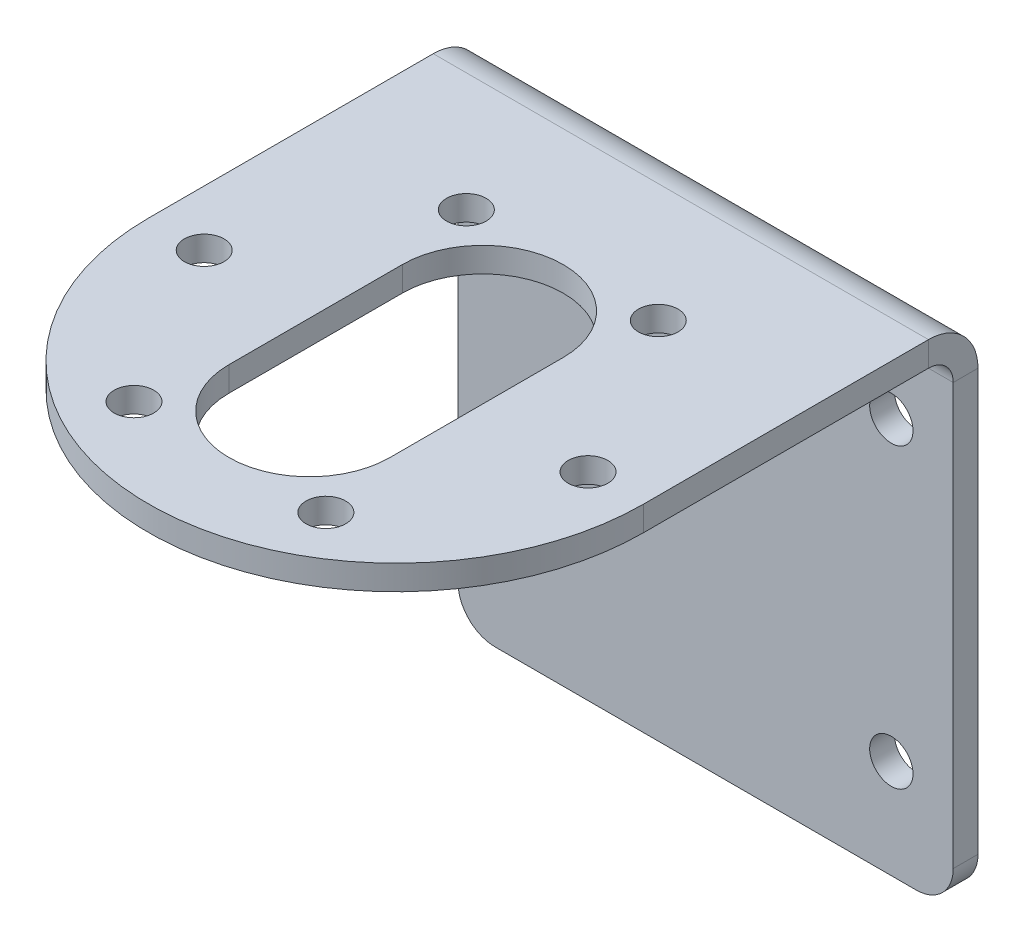
ISO-10303-21;
HEADER;
FILE_DESCRIPTION(('STEP AP214'),'2;1');
FILE_NAME('part.step','',(''),(''),'','','');
FILE_SCHEMA(('AUTOMOTIVE_DESIGN { 1 0 10303 214 1 1 1 1 }'));
ENDSEC;
DATA;
#1=APPLICATION_CONTEXT('core data for automotive mechanical design processes');
#2=APPLICATION_PROTOCOL_DEFINITION('international standard','automotive_design',2000,#1);
#3=PRODUCT_CONTEXT('',#1,'mechanical');
#4=PRODUCT('Part','Part','',(#3));
#5=PRODUCT_RELATED_PRODUCT_CATEGORY('part','',(#4));
#6=PRODUCT_DEFINITION_FORMATION('','',#4);
#7=PRODUCT_DEFINITION_CONTEXT('part definition',#1,'design');
#8=PRODUCT_DEFINITION('design','',#6,#7);
#9=PRODUCT_DEFINITION_SHAPE('','',#8);
#10=(LENGTH_UNIT() NAMED_UNIT(*) SI_UNIT(.MILLI.,.METRE.));
#11=(NAMED_UNIT(*) PLANE_ANGLE_UNIT() SI_UNIT($,.RADIAN.));
#12=(NAMED_UNIT(*) SI_UNIT($,.STERADIAN.) SOLID_ANGLE_UNIT());
#13=UNCERTAINTY_MEASURE_WITH_UNIT(LENGTH_MEASURE(1.E-05),#10,'distance_accuracy_value','');
#14=(GEOMETRIC_REPRESENTATION_CONTEXT(3) GLOBAL_UNCERTAINTY_ASSIGNED_CONTEXT((#13)) GLOBAL_UNIT_ASSIGNED_CONTEXT((#10,
#11,#12)) REPRESENTATION_CONTEXT('',''));
#15=CARTESIAN_POINT('',(0.,0.,0.));
#16=DIRECTION('',(0.,0.,1.));
#17=DIRECTION('',(1.,0.,0.));
#18=AXIS2_PLACEMENT_3D('',#15,#16,#17);
#19=CARTESIAN_POINT('',(7.75,21.5,13.576606241341));
#20=DIRECTION('',(0.,-1.,0.));
#21=DIRECTION('',(-1.,0.,0.));
#22=AXIS2_PLACEMENT_3D('',#19,#20,#21);
#23=CYLINDRICAL_SURFACE('',#22,1.6);
#24=CARTESIAN_POINT('',(7.75,21.5,13.576606241341));
#25=DIRECTION('',(0.,1.,0.));
#26=DIRECTION('',(-1.,0.,0.));
#27=AXIS2_PLACEMENT_3D('',#24,#25,#26);
#28=CIRCLE('',#27,1.6);
#29=CARTESIAN_POINT('',(6.15,21.5,13.576606241341));
#30=VERTEX_POINT('',#29);
#31=EDGE_CURVE('E240',#30,#30,#28,.T.);
#32=ORIENTED_EDGE('',*,*,#31,.T.);
#33=DIRECTION('',(0.,-1.,0.));
#34=VECTOR('',#33,1.);
#35=CARTESIAN_POINT('',(6.15,21.5,13.576606241341));
#36=LINE('',#35,#34);
#37=CARTESIAN_POINT('',(6.15,19.5,13.576606241341));
#38=VERTEX_POINT('',#37);
#39=EDGE_CURVE('E11',#30,#38,#36,.T.);
#40=ORIENTED_EDGE('',*,*,#39,.T.);
#41=CARTESIAN_POINT('',(7.75,19.5,13.576606241341));
#42=DIRECTION('',(0.,-1.,0.));
#43=DIRECTION('',(-1.,0.,0.));
#44=AXIS2_PLACEMENT_3D('',#41,#42,#43);
#45=CIRCLE('',#44,1.6);
#46=EDGE_CURVE('E235',#38,#38,#45,.T.);
#47=ORIENTED_EDGE('',*,*,#46,.T.);
#48=ORIENTED_EDGE('',*,*,#39,.F.);
#49=EDGE_LOOP('',(#32,#40,#47,#48));
#50=FACE_BOUND('',#49,.T.);
#51=ADVANCED_FACE('F16',(#50),#23,.F.);
#52=CARTESIAN_POINT('',(15.5,21.5,27.));
#53=DIRECTION('',(0.,-1.,0.));
#54=DIRECTION('',(-1.,0.,0.));
#55=AXIS2_PLACEMENT_3D('',#52,#53,#54);
#56=CYLINDRICAL_SURFACE('',#55,1.6);
#57=CARTESIAN_POINT('',(15.5,21.5,27.));
#58=DIRECTION('',(0.,1.,0.));
#59=DIRECTION('',(-1.,0.,0.));
#60=AXIS2_PLACEMENT_3D('',#57,#58,#59);
#61=CIRCLE('',#60,1.6);
#62=CARTESIAN_POINT('',(13.9,21.5,27.));
#63=VERTEX_POINT('',#62);
#64=EDGE_CURVE('E236',#63,#63,#61,.T.);
#65=ORIENTED_EDGE('',*,*,#64,.T.);
#66=DIRECTION('',(0.,-1.,0.));
#67=VECTOR('',#66,1.);
#68=CARTESIAN_POINT('',(13.9,21.5,27.));
#69=LINE('',#68,#67);
#70=CARTESIAN_POINT('',(13.9,19.5,27.));
#71=VERTEX_POINT('',#70);
#72=EDGE_CURVE('E27',#63,#71,#69,.T.);
#73=ORIENTED_EDGE('',*,*,#72,.T.);
#74=CARTESIAN_POINT('',(15.5,19.5,27.));
#75=DIRECTION('',(0.,-1.,0.));
#76=DIRECTION('',(-1.,0.,0.));
#77=AXIS2_PLACEMENT_3D('',#74,#75,#76);
#78=CIRCLE('',#77,1.6);
#79=EDGE_CURVE('E321',#71,#71,#78,.T.);
#80=ORIENTED_EDGE('',*,*,#79,.T.);
#81=ORIENTED_EDGE('',*,*,#72,.F.);
#82=EDGE_LOOP('',(#65,#73,#80,#81));
#83=FACE_BOUND('',#82,.T.);
#84=ADVANCED_FACE('F588',(#83),#56,.F.);
#85=CARTESIAN_POINT('',(7.75,21.5,40.423393758659));
#86=DIRECTION('',(0.,-1.,0.));
#87=DIRECTION('',(-1.,0.,0.));
#88=AXIS2_PLACEMENT_3D('',#85,#86,#87);
#89=CYLINDRICAL_SURFACE('',#88,1.6);
#90=CARTESIAN_POINT('',(7.75,21.5,40.423393758659));
#91=DIRECTION('',(0.,1.,0.));
#92=DIRECTION('',(-1.,0.,0.));
#93=AXIS2_PLACEMENT_3D('',#90,#91,#92);
#94=CIRCLE('',#93,1.6);
#95=CARTESIAN_POINT('',(6.15,21.5,40.423393758659));
#96=VERTEX_POINT('',#95);
#97=EDGE_CURVE('E241',#96,#96,#94,.T.);
#98=ORIENTED_EDGE('',*,*,#97,.T.);
#99=DIRECTION('',(0.,-1.,0.));
#100=VECTOR('',#99,1.);
#101=CARTESIAN_POINT('',(6.15,21.5,40.423393758659));
#102=LINE('',#101,#100);
#103=CARTESIAN_POINT('',(6.15,19.5,40.423393758659));
#104=VERTEX_POINT('',#103);
#105=EDGE_CURVE('E250',#96,#104,#102,.T.);
#106=ORIENTED_EDGE('',*,*,#105,.T.);
#107=CARTESIAN_POINT('',(7.75,19.5,40.423393758659));
#108=DIRECTION('',(0.,-1.,0.));
#109=DIRECTION('',(-1.,0.,0.));
#110=AXIS2_PLACEMENT_3D('',#107,#108,#109);
#111=CIRCLE('',#110,1.6);
#112=EDGE_CURVE('E317',#104,#104,#111,.T.);
#113=ORIENTED_EDGE('',*,*,#112,.T.);
#114=ORIENTED_EDGE('',*,*,#105,.F.);
#115=EDGE_LOOP('',(#98,#106,#113,#114));
#116=FACE_BOUND('',#115,.T.);
#117=ADVANCED_FACE('F594',(#116),#89,.F.);
#118=CARTESIAN_POINT('',(-7.75,21.5,40.423393758659));
#119=DIRECTION('',(0.,-1.,0.));
#120=DIRECTION('',(-1.,0.,0.));
#121=AXIS2_PLACEMENT_3D('',#118,#119,#120);
#122=CYLINDRICAL_SURFACE('',#121,1.6);
#123=CARTESIAN_POINT('',(-7.75,21.5,40.423393758659));
#124=DIRECTION('',(0.,1.,0.));
#125=DIRECTION('',(-1.,0.,0.));
#126=AXIS2_PLACEMENT_3D('',#123,#124,#125);
#127=CIRCLE('',#126,1.6);
#128=CARTESIAN_POINT('',(-9.35,21.5,40.423393758659));
#129=VERTEX_POINT('',#128);
#130=EDGE_CURVE('E299',#129,#129,#127,.T.);
#131=ORIENTED_EDGE('',*,*,#130,.T.);
#132=DIRECTION('',(0.,-1.,0.));
#133=VECTOR('',#132,1.);
#134=CARTESIAN_POINT('',(-9.35,21.5,40.423393758659));
#135=LINE('',#134,#133);
#136=CARTESIAN_POINT('',(-9.35,19.5,40.423393758659));
#137=VERTEX_POINT('',#136);
#138=EDGE_CURVE('E41',#129,#137,#135,.T.);
#139=ORIENTED_EDGE('',*,*,#138,.T.);
#140=CARTESIAN_POINT('',(-7.75,19.5,40.423393758659));
#141=DIRECTION('',(0.,-1.,0.));
#142=DIRECTION('',(-1.,0.,0.));
#143=AXIS2_PLACEMENT_3D('',#140,#141,#142);
#144=CIRCLE('',#143,1.6);
#145=EDGE_CURVE('E231',#137,#137,#144,.T.);
#146=ORIENTED_EDGE('',*,*,#145,.T.);
#147=ORIENTED_EDGE('',*,*,#138,.F.);
#148=EDGE_LOOP('',(#131,#139,#146,#147));
#149=FACE_BOUND('',#148,.T.);
#150=ADVANCED_FACE('F620',(#149),#122,.F.);
#151=CARTESIAN_POINT('',(-7.75,21.5,13.576606241341));
#152=DIRECTION('',(0.,-1.,0.));
#153=DIRECTION('',(-1.,0.,0.));
#154=AXIS2_PLACEMENT_3D('',#151,#152,#153);
#155=CYLINDRICAL_SURFACE('',#154,1.6);
#156=CARTESIAN_POINT('',(-7.75,21.5,13.576606241341));
#157=DIRECTION('',(0.,1.,0.));
#158=DIRECTION('',(-1.,0.,0.));
#159=AXIS2_PLACEMENT_3D('',#156,#157,#158);
#160=CIRCLE('',#159,1.6);
#161=CARTESIAN_POINT('',(-9.35,21.5,13.576606241341));
#162=VERTEX_POINT('',#161);
#163=EDGE_CURVE('E295',#162,#162,#160,.T.);
#164=ORIENTED_EDGE('',*,*,#163,.T.);
#165=DIRECTION('',(0.,-1.,0.));
#166=VECTOR('',#165,1.);
#167=CARTESIAN_POINT('',(-9.35,21.5,13.576606241341));
#168=LINE('',#167,#166);
#169=CARTESIAN_POINT('',(-9.35,19.5,13.576606241341));
#170=VERTEX_POINT('',#169);
#171=EDGE_CURVE('E220',#162,#170,#168,.T.);
#172=ORIENTED_EDGE('',*,*,#171,.T.);
#173=CARTESIAN_POINT('',(-7.75,19.5,13.576606241341));
#174=DIRECTION('',(0.,-1.,0.));
#175=DIRECTION('',(-1.,0.,0.));
#176=AXIS2_PLACEMENT_3D('',#173,#174,#175);
#177=CIRCLE('',#176,1.6);
#178=EDGE_CURVE('E322',#170,#170,#177,.T.);
#179=ORIENTED_EDGE('',*,*,#178,.T.);
#180=ORIENTED_EDGE('',*,*,#171,.F.);
#181=EDGE_LOOP('',(#164,#172,#179,#180));
#182=FACE_BOUND('',#181,.T.);
#183=ADVANCED_FACE('F616',(#182),#155,.F.);
#184=CARTESIAN_POINT('',(-15.5,21.5,27.));
#185=DIRECTION('',(0.,-1.,0.));
#186=DIRECTION('',(-1.,0.,0.));
#187=AXIS2_PLACEMENT_3D('',#184,#185,#186);
#188=CYLINDRICAL_SURFACE('',#187,1.6);
#189=CARTESIAN_POINT('',(-15.5,21.5,27.));
#190=DIRECTION('',(0.,1.,0.));
#191=DIRECTION('',(-1.,0.,0.));
#192=AXIS2_PLACEMENT_3D('',#189,#190,#191);
#193=CIRCLE('',#192,1.6);
#194=CARTESIAN_POINT('',(-17.1,21.5,27.));
#195=VERTEX_POINT('',#194);
#196=EDGE_CURVE('E300',#195,#195,#193,.T.);
#197=ORIENTED_EDGE('',*,*,#196,.T.);
#198=DIRECTION('',(0.,-1.,0.));
#199=VECTOR('',#198,1.);
#200=CARTESIAN_POINT('',(-17.1,21.5,27.));
#201=LINE('',#200,#199);
#202=CARTESIAN_POINT('',(-17.1,19.5,27.));
#203=VERTEX_POINT('',#202);
#204=EDGE_CURVE('E224',#195,#203,#201,.T.);
#205=ORIENTED_EDGE('',*,*,#204,.T.);
#206=CARTESIAN_POINT('',(-15.5,19.5,27.));
#207=DIRECTION('',(0.,-1.,0.));
#208=DIRECTION('',(-1.,0.,0.));
#209=AXIS2_PLACEMENT_3D('',#206,#207,#208);
#210=CIRCLE('',#209,1.6);
#211=EDGE_CURVE('E380',#203,#203,#210,.T.);
#212=ORIENTED_EDGE('',*,*,#211,.T.);
#213=ORIENTED_EDGE('',*,*,#204,.F.);
#214=EDGE_LOOP('',(#197,#205,#212,#213));
#215=FACE_BOUND('',#214,.T.);
#216=ADVANCED_FACE('F619',(#215),#188,.F.);
#217=CARTESIAN_POINT('',(0.,21.5,34.));
#218=DIRECTION('',(0.,-1.,0.));
#219=DIRECTION('',(-1.,0.,0.));
#220=AXIS2_PLACEMENT_3D('',#217,#218,#219);
#221=CYLINDRICAL_SURFACE('',#220,6.5);
#222=CARTESIAN_POINT('',(0.,21.5,34.));
#223=DIRECTION('',(0.,1.,0.));
#224=DIRECTION('',(-1.,0.,0.));
#225=AXIS2_PLACEMENT_3D('',#222,#223,#224);
#226=CIRCLE('',#225,6.5);
#227=CARTESIAN_POINT('',(-6.5,21.5,34.));
#228=VERTEX_POINT('',#227);
#229=CARTESIAN_POINT('',(6.5,21.5,34.));
#230=VERTEX_POINT('',#229);
#231=EDGE_CURVE('E283',#228,#230,#226,.T.);
#232=ORIENTED_EDGE('',*,*,#231,.T.);
#233=DIRECTION('',(0.,-1.,0.));
#234=VECTOR('',#233,1.);
#235=CARTESIAN_POINT('',(6.5,21.5,34.));
#236=LINE('',#235,#234);
#237=CARTESIAN_POINT('',(6.5,19.5,34.));
#238=VERTEX_POINT('',#237);
#239=EDGE_CURVE('E284',#230,#238,#236,.T.);
#240=ORIENTED_EDGE('',*,*,#239,.T.);
#241=CARTESIAN_POINT('',(0.,19.5,34.));
#242=DIRECTION('',(0.,-1.,0.));
#243=DIRECTION('',(1.,0.,0.));
#244=AXIS2_PLACEMENT_3D('',#241,#242,#243);
#245=CIRCLE('',#244,6.5);
#246=CARTESIAN_POINT('',(-6.5,19.5,34.));
#247=VERTEX_POINT('',#246);
#248=EDGE_CURVE('E255',#238,#247,#245,.T.);
#249=ORIENTED_EDGE('',*,*,#248,.T.);
#250=DIRECTION('',(0.,-1.,0.));
#251=VECTOR('',#250,1.);
#252=CARTESIAN_POINT('',(-6.5,21.5,34.));
#253=LINE('',#252,#251);
#254=EDGE_CURVE('E288',#228,#247,#253,.T.);
#255=ORIENTED_EDGE('',*,*,#254,.F.);
#256=EDGE_LOOP('',(#232,#240,#249,#255));
#257=FACE_BOUND('',#256,.T.);
#258=ADVANCED_FACE('F628',(#257),#221,.F.);
#259=CARTESIAN_POINT('',(-6.5,20.,27.));
#260=DIRECTION('',(1.,0.,0.));
#261=DIRECTION('',(0.,1.,0.));
#262=AXIS2_PLACEMENT_3D('',#259,#260,#261);
#263=PLANE('',#262);
#264=DIRECTION('',(0.,0.,1.));
#265=VECTOR('',#264,1.);
#266=CARTESIAN_POINT('',(-6.5,21.5,20.));
#267=LINE('',#266,#265);
#268=CARTESIAN_POINT('',(-6.5,21.5,20.));
#269=VERTEX_POINT('',#268);
#270=EDGE_CURVE('E278',#269,#228,#267,.T.);
#271=ORIENTED_EDGE('',*,*,#270,.T.);
#272=ORIENTED_EDGE('',*,*,#254,.T.);
#273=DIRECTION('',(0.,0.,-1.));
#274=VECTOR('',#273,1.);
#275=CARTESIAN_POINT('',(-6.5,19.5,34.));
#276=LINE('',#275,#274);
#277=CARTESIAN_POINT('',(-6.5,19.5,20.));
#278=VERTEX_POINT('',#277);
#279=EDGE_CURVE('E251',#247,#278,#276,.T.);
#280=ORIENTED_EDGE('',*,*,#279,.T.);
#281=DIRECTION('',(0.,-1.,0.));
#282=VECTOR('',#281,1.);
#283=CARTESIAN_POINT('',(-6.5,21.5,20.));
#284=LINE('',#283,#282);
#285=EDGE_CURVE('E287',#269,#278,#284,.T.);
#286=ORIENTED_EDGE('',*,*,#285,.F.);
#287=EDGE_LOOP('',(#271,#272,#280,#286));
#288=FACE_BOUND('',#287,.T.);
#289=ADVANCED_FACE('F610',(#288),#263,.T.);
#290=CARTESIAN_POINT('',(0.,21.5,20.));
#291=DIRECTION('',(0.,-1.,0.));
#292=DIRECTION('',(1.,0.,0.));
#293=AXIS2_PLACEMENT_3D('',#290,#291,#292);
#294=CYLINDRICAL_SURFACE('',#293,6.5);
#295=CARTESIAN_POINT('',(0.,21.5,20.));
#296=DIRECTION('',(0.,1.,0.));
#297=DIRECTION('',(1.,0.,0.));
#298=AXIS2_PLACEMENT_3D('',#295,#296,#297);
#299=CIRCLE('',#298,6.5);
#300=CARTESIAN_POINT('',(6.5,21.5,20.));
#301=VERTEX_POINT('',#300);
#302=EDGE_CURVE('E282',#301,#269,#299,.T.);
#303=ORIENTED_EDGE('',*,*,#302,.T.);
#304=ORIENTED_EDGE('',*,*,#285,.T.);
#305=CARTESIAN_POINT('',(0.,19.5,20.));
#306=DIRECTION('',(0.,-1.,0.));
#307=DIRECTION('',(-1.,0.,0.));
#308=AXIS2_PLACEMENT_3D('',#305,#306,#307);
#309=CIRCLE('',#308,6.5);
#310=CARTESIAN_POINT('',(6.5,19.5,20.));
#311=VERTEX_POINT('',#310);
#312=EDGE_CURVE('E256',#278,#311,#309,.T.);
#313=ORIENTED_EDGE('',*,*,#312,.T.);
#314=DIRECTION('',(0.,-1.,0.));
#315=VECTOR('',#314,1.);
#316=CARTESIAN_POINT('',(6.5,21.5,20.));
#317=LINE('',#316,#315);
#318=EDGE_CURVE('E234',#301,#311,#317,.T.);
#319=ORIENTED_EDGE('',*,*,#318,.F.);
#320=EDGE_LOOP('',(#303,#304,#313,#319));
#321=FACE_BOUND('',#320,.T.);
#322=ADVANCED_FACE('F604',(#321),#294,.F.);
#323=CARTESIAN_POINT('',(6.5,20.,27.));
#324=DIRECTION('',(-1.,0.,0.));
#325=DIRECTION('',(0.,1.,0.));
#326=AXIS2_PLACEMENT_3D('',#323,#324,#325);
#327=PLANE('',#326);
#328=DIRECTION('',(0.,0.,-1.));
#329=VECTOR('',#328,1.);
#330=CARTESIAN_POINT('',(6.5,21.5,34.));
#331=LINE('',#330,#329);
#332=EDGE_CURVE('E345',#230,#301,#331,.T.);
#333=ORIENTED_EDGE('',*,*,#332,.T.);
#334=ORIENTED_EDGE('',*,*,#318,.T.);
#335=DIRECTION('',(0.,0.,1.));
#336=VECTOR('',#335,1.);
#337=CARTESIAN_POINT('',(6.5,19.5,20.));
#338=LINE('',#337,#336);
#339=EDGE_CURVE('E349',#311,#238,#338,.T.);
#340=ORIENTED_EDGE('',*,*,#339,.T.);
#341=ORIENTED_EDGE('',*,*,#239,.F.);
#342=EDGE_LOOP('',(#333,#334,#340,#341));
#343=FACE_BOUND('',#342,.T.);
#344=ADVANCED_FACE('F600',(#343),#327,.T.);
#345=CARTESIAN_POINT('',(0.,21.5,27.));
#346=DIRECTION('',(0.,-1.,0.));
#347=DIRECTION('',(1.,0.,0.));
#348=AXIS2_PLACEMENT_3D('',#345,#346,#347);
#349=CYLINDRICAL_SURFACE('',#348,20.);
#350=DIRECTION('',(0.,-1.,0.));
#351=VECTOR('',#350,1.);
#352=CARTESIAN_POINT('',(-20.,21.5,27.));
#353=LINE('',#352,#351);
#354=CARTESIAN_POINT('',(-20.,21.5,27.));
#355=VERTEX_POINT('',#354);
#356=CARTESIAN_POINT('',(-20.,19.5,27.));
#357=VERTEX_POINT('',#356);
#358=EDGE_CURVE('E395',#355,#357,#353,.T.);
#359=ORIENTED_EDGE('',*,*,#358,.T.);
#360=CARTESIAN_POINT('',(0.,19.5,27.));
#361=DIRECTION('',(0.,1.,0.));
#362=DIRECTION('',(-1.,0.,0.));
#363=AXIS2_PLACEMENT_3D('',#360,#361,#362);
#364=CIRCLE('',#363,20.);
#365=CARTESIAN_POINT('',(20.,19.5,27.));
#366=VERTEX_POINT('',#365);
#367=EDGE_CURVE('E393',#357,#366,#364,.T.);
#368=ORIENTED_EDGE('',*,*,#367,.T.);
#369=DIRECTION('',(0.,-1.,0.));
#370=VECTOR('',#369,1.);
#371=CARTESIAN_POINT('',(20.,21.5,27.));
#372=LINE('',#371,#370);
#373=CARTESIAN_POINT('',(20.,21.5,27.));
#374=VERTEX_POINT('',#373);
#375=EDGE_CURVE('E225',#374,#366,#372,.T.);
#376=ORIENTED_EDGE('',*,*,#375,.F.);
#377=CARTESIAN_POINT('',(0.,21.5,27.));
#378=DIRECTION('',(0.,-1.,0.));
#379=DIRECTION('',(1.,0.,0.));
#380=AXIS2_PLACEMENT_3D('',#377,#378,#379);
#381=CIRCLE('',#380,20.);
#382=EDGE_CURVE('E311',#374,#355,#381,.T.);
#383=ORIENTED_EDGE('',*,*,#382,.T.);
#384=EDGE_LOOP('',(#359,#368,#376,#383));
#385=FACE_BOUND('',#384,.T.);
#386=ADVANCED_FACE('F603',(#385),#349,.T.);
#387=CARTESIAN_POINT('',(0.,19.5,25.5));
#388=DIRECTION('',(0.,1.,0.));
#389=DIRECTION('',(0.,0.,-1.));
#390=AXIS2_PLACEMENT_3D('',#387,#388,#389);
#391=PLANE('',#390);
#392=ORIENTED_EDGE('',*,*,#145,.F.);
#393=EDGE_LOOP('',(#392));
#394=FACE_BOUND('',#393,.T.);
#395=ORIENTED_EDGE('',*,*,#46,.F.);
#396=EDGE_LOOP('',(#395));
#397=FACE_BOUND('',#396,.T.);
#398=ORIENTED_EDGE('',*,*,#79,.F.);
#399=EDGE_LOOP('',(#398));
#400=FACE_BOUND('',#399,.T.);
#401=ORIENTED_EDGE('',*,*,#112,.F.);
#402=EDGE_LOOP('',(#401));
#403=FACE_BOUND('',#402,.T.);
#404=ORIENTED_EDGE('',*,*,#178,.F.);
#405=EDGE_LOOP('',(#404));
#406=FACE_BOUND('',#405,.T.);
#407=ORIENTED_EDGE('',*,*,#211,.F.);
#408=EDGE_LOOP('',(#407));
#409=FACE_BOUND('',#408,.T.);
#410=ORIENTED_EDGE('',*,*,#312,.F.);
#411=ORIENTED_EDGE('',*,*,#279,.F.);
#412=ORIENTED_EDGE('',*,*,#248,.F.);
#413=ORIENTED_EDGE('',*,*,#339,.F.);
#414=EDGE_LOOP('',(#410,#411,#412,#413));
#415=FACE_BOUND('',#414,.T.);
#416=DIRECTION('',(-1.,0.,0.));
#417=VECTOR('',#416,1.);
#418=CARTESIAN_POINT('',(20.,19.5,4.));
#419=LINE('',#418,#417);
#420=CARTESIAN_POINT('',(20.,19.5,4.));
#421=VERTEX_POINT('',#420);
#422=CARTESIAN_POINT('',(-20.,19.5,4.));
#423=VERTEX_POINT('',#422);
#424=EDGE_CURVE('E246',#421,#423,#419,.T.);
#425=ORIENTED_EDGE('',*,*,#424,.F.);
#426=DIRECTION('',(0.,0.,-1.));
#427=VECTOR('',#426,1.);
#428=CARTESIAN_POINT('',(20.,19.5,27.));
#429=LINE('',#428,#427);
#430=EDGE_CURVE('E229',#366,#421,#429,.T.);
#431=ORIENTED_EDGE('',*,*,#430,.F.);
#432=ORIENTED_EDGE('',*,*,#367,.F.);
#433=DIRECTION('',(0.,0.,-1.));
#434=VECTOR('',#433,1.);
#435=CARTESIAN_POINT('',(-20.,19.5,27.));
#436=LINE('',#435,#434);
#437=EDGE_CURVE('E272',#357,#423,#436,.T.);
#438=ORIENTED_EDGE('',*,*,#437,.T.);
#439=EDGE_LOOP('',(#425,#431,#432,#438));
#440=FACE_BOUND('',#439,.T.);
#441=ADVANCED_FACE('F446',(#394,#397,#400,#403,#406,#409,#415,#440),#391,.F.);
#442=CARTESIAN_POINT('',(0.,21.5,25.5));
#443=DIRECTION('',(0.,-1.,0.));
#444=DIRECTION('',(-1.,0.,0.));
#445=AXIS2_PLACEMENT_3D('',#442,#443,#444);
#446=PLANE('',#445);
#447=ORIENTED_EDGE('',*,*,#31,.F.);
#448=EDGE_LOOP('',(#447));
#449=FACE_BOUND('',#448,.T.);
#450=ORIENTED_EDGE('',*,*,#64,.F.);
#451=EDGE_LOOP('',(#450));
#452=FACE_BOUND('',#451,.T.);
#453=ORIENTED_EDGE('',*,*,#97,.F.);
#454=EDGE_LOOP('',(#453));
#455=FACE_BOUND('',#454,.T.);
#456=ORIENTED_EDGE('',*,*,#130,.F.);
#457=EDGE_LOOP('',(#456));
#458=FACE_BOUND('',#457,.T.);
#459=ORIENTED_EDGE('',*,*,#163,.F.);
#460=EDGE_LOOP('',(#459));
#461=FACE_BOUND('',#460,.T.);
#462=ORIENTED_EDGE('',*,*,#196,.F.);
#463=EDGE_LOOP('',(#462));
#464=FACE_BOUND('',#463,.T.);
#465=ORIENTED_EDGE('',*,*,#231,.F.);
#466=ORIENTED_EDGE('',*,*,#270,.F.);
#467=ORIENTED_EDGE('',*,*,#302,.F.);
#468=ORIENTED_EDGE('',*,*,#332,.F.);
#469=EDGE_LOOP('',(#465,#466,#467,#468));
#470=FACE_BOUND('',#469,.T.);
#471=DIRECTION('',(-1.,0.,0.));
#472=VECTOR('',#471,1.);
#473=CARTESIAN_POINT('',(20.,21.5,4.));
#474=LINE('',#473,#472);
#475=CARTESIAN_POINT('',(20.,21.5,4.));
#476=VERTEX_POINT('',#475);
#477=CARTESIAN_POINT('',(-20.,21.5,4.));
#478=VERTEX_POINT('',#477);
#479=EDGE_CURVE('E242',#476,#478,#474,.T.);
#480=ORIENTED_EDGE('',*,*,#479,.T.);
#481=DIRECTION('',(0.,0.,1.));
#482=VECTOR('',#481,1.);
#483=CARTESIAN_POINT('',(-20.,21.5,4.));
#484=LINE('',#483,#482);
#485=EDGE_CURVE('E387',#478,#355,#484,.T.);
#486=ORIENTED_EDGE('',*,*,#485,.T.);
#487=ORIENTED_EDGE('',*,*,#382,.F.);
#488=DIRECTION('',(0.,0.,1.));
#489=VECTOR('',#488,1.);
#490=CARTESIAN_POINT('',(20.,21.5,4.));
#491=LINE('',#490,#489);
#492=EDGE_CURVE('E230',#476,#374,#491,.T.);
#493=ORIENTED_EDGE('',*,*,#492,.F.);
#494=EDGE_LOOP('',(#480,#486,#487,#493));
#495=FACE_BOUND('',#494,.T.);
#496=ADVANCED_FACE('F702',(#449,#452,#455,#458,#461,#464,#470,#495),#446,.F.);
#497=CARTESIAN_POINT('',(-20.,41.,25.5));
#498=DIRECTION('',(1.,0.,0.));
#499=DIRECTION('',(0.,1.,0.));
#500=AXIS2_PLACEMENT_3D('',#497,#498,#499);
#501=PLANE('',#500);
#502=ORIENTED_EDGE('',*,*,#437,.F.);
#503=ORIENTED_EDGE('',*,*,#358,.F.);
#504=ORIENTED_EDGE('',*,*,#485,.F.);
#505=DIRECTION('',(0.,1.,0.));
#506=VECTOR('',#505,1.);
#507=CARTESIAN_POINT('',(-20.,19.5,4.));
#508=LINE('',#507,#506);
#509=EDGE_CURVE('E341',#423,#478,#508,.T.);
#510=ORIENTED_EDGE('',*,*,#509,.F.);
#511=EDGE_LOOP('',(#502,#503,#504,#510));
#512=FACE_BOUND('',#511,.T.);
#513=ADVANCED_FACE('F451',(#512),#501,.F.);
#514=CARTESIAN_POINT('',(20.,41.,25.5));
#515=DIRECTION('',(1.,0.,0.));
#516=DIRECTION('',(0.,1.,0.));
#517=AXIS2_PLACEMENT_3D('',#514,#515,#516);
#518=PLANE('',#517);
#519=DIRECTION('',(0.,1.,0.));
#520=VECTOR('',#519,1.);
#521=CARTESIAN_POINT('',(20.,19.5,4.));
#522=LINE('',#521,#520);
#523=EDGE_CURVE('E269',#421,#476,#522,.T.);
#524=ORIENTED_EDGE('',*,*,#523,.T.);
#525=ORIENTED_EDGE('',*,*,#492,.T.);
#526=ORIENTED_EDGE('',*,*,#375,.T.);
#527=ORIENTED_EDGE('',*,*,#430,.T.);
#528=EDGE_LOOP('',(#524,#525,#526,#527));
#529=FACE_BOUND('',#528,.T.);
#530=ADVANCED_FACE('F727',(#529),#518,.T.);
#531=CARTESIAN_POINT('',(-20.,17.3,-0.2));
#532=CARTESIAN_POINT('',(-20.,21.7,-0.2));
#533=CARTESIAN_POINT('',(-20.,17.3,4.2));
#534=CARTESIAN_POINT('',(-20.,21.7,4.2));
#535=(BOUNDED_SURFACE() B_SPLINE_SURFACE(1,1,((#531,#532),(#533,#534)),.UNSPECIFIED.,.F.,.F.,
.F.) B_SPLINE_SURFACE_WITH_KNOTS((2,2),(2,2),(0.,1.),(0.,1.),
.UNSPECIFIED.) GEOMETRIC_REPRESENTATION_ITEM() RATIONAL_B_SPLINE_SURFACE(((1.,1.),(1.,1.))) REPRESENTATION_ITEM('') SURFACE());
#536=CARTESIAN_POINT('',(-20.,17.5,4.));
#537=DIRECTION('',(-1.,0.,0.));
#538=DIRECTION('',(0.,1.,0.));
#539=AXIS2_PLACEMENT_3D('',#536,#537,#538);
#540=CIRCLE('',#539,4.);
#541=CARTESIAN_POINT('',(-20.,17.5,0.));
#542=VERTEX_POINT('',#541);
#543=EDGE_CURVE('E247',#478,#542,#540,.T.);
#544=DIRECTION('',(0.,0.,-1.));
#545=VECTOR('',#544,1.);
#546=CARTESIAN_POINT('',(-20.,17.5,2.));
#547=LINE('',#546,#545);
#548=CARTESIAN_POINT('',(-20.,17.5,2.));
#549=VERTEX_POINT('',#548);
#550=EDGE_CURVE('E316',#549,#542,#547,.T.);
#551=CARTESIAN_POINT('',(-20.,17.5,4.));
#552=DIRECTION('',(1.,0.,0.));
#553=DIRECTION('',(0.,0.,-1.));
#554=AXIS2_PLACEMENT_3D('',#551,#552,#553);
#555=CIRCLE('',#554,2.);
#556=EDGE_CURVE('E337',#549,#423,#555,.T.);
#557=ORIENTED_EDGE('',*,*,#509,.T.);
#558=ORIENTED_EDGE('',*,*,#543,.T.);
#559=ORIENTED_EDGE('',*,*,#550,.F.);
#560=ORIENTED_EDGE('',*,*,#556,.T.);
#561=EDGE_LOOP('',(#557,#558,#559,#560));
#562=FACE_BOUND('',#561,.T.);
#563=ADVANCED_FACE('F455',(#562),#535,.T.);
#564=CARTESIAN_POINT('',(20.,17.5,4.));
#565=DIRECTION('',(-1.,0.,0.));
#566=DIRECTION('',(0.,0.,-1.));
#567=AXIS2_PLACEMENT_3D('',#564,#565,#566);
#568=CYLINDRICAL_SURFACE('',#567,2.);
#569=CARTESIAN_POINT('',(20.,17.5,4.));
#570=DIRECTION('',(1.,0.,0.));
#571=DIRECTION('',(0.,0.,-1.));
#572=AXIS2_PLACEMENT_3D('',#569,#570,#571);
#573=CIRCLE('',#572,2.);
#574=CARTESIAN_POINT('',(20.,17.5,2.));
#575=VERTEX_POINT('',#574);
#576=EDGE_CURVE('E399',#575,#421,#573,.T.);
#577=ORIENTED_EDGE('',*,*,#576,.T.);
#578=ORIENTED_EDGE('',*,*,#424,.T.);
#579=ORIENTED_EDGE('',*,*,#556,.F.);
#580=DIRECTION('',(-1.,0.,0.));
#581=VECTOR('',#580,1.);
#582=CARTESIAN_POINT('',(20.,17.5,2.));
#583=LINE('',#582,#581);
#584=EDGE_CURVE('E215',#575,#549,#583,.T.);
#585=ORIENTED_EDGE('',*,*,#584,.F.);
#586=EDGE_LOOP('',(#577,#578,#579,#585));
#587=FACE_BOUND('',#586,.T.);
#588=ADVANCED_FACE('F460',(#587),#568,.F.);
#589=CARTESIAN_POINT('',(20.,17.5,4.));
#590=DIRECTION('',(-1.,0.,0.));
#591=DIRECTION('',(0.,1.,0.));
#592=AXIS2_PLACEMENT_3D('',#589,#590,#591);
#593=CYLINDRICAL_SURFACE('',#592,4.);
#594=CARTESIAN_POINT('',(20.,17.5,4.));
#595=DIRECTION('',(-1.,0.,0.));
#596=DIRECTION('',(0.,1.,0.));
#597=AXIS2_PLACEMENT_3D('',#594,#595,#596);
#598=CIRCLE('',#597,4.);
#599=CARTESIAN_POINT('',(20.,17.5,0.));
#600=VERTEX_POINT('',#599);
#601=EDGE_CURVE('E359',#476,#600,#598,.T.);
#602=ORIENTED_EDGE('',*,*,#601,.T.);
#603=DIRECTION('',(-1.,0.,0.));
#604=VECTOR('',#603,1.);
#605=CARTESIAN_POINT('',(20.,17.5,0.));
#606=LINE('',#605,#604);
#607=EDGE_CURVE('E261',#600,#542,#606,.T.);
#608=ORIENTED_EDGE('',*,*,#607,.T.);
#609=ORIENTED_EDGE('',*,*,#543,.F.);
#610=ORIENTED_EDGE('',*,*,#479,.F.);
#611=EDGE_LOOP('',(#602,#608,#609,#610));
#612=FACE_BOUND('',#611,.T.);
#613=ADVANCED_FACE('F518',(#612),#593,.T.);
#614=CARTESIAN_POINT('',(20.,17.3,-0.2));
#615=CARTESIAN_POINT('',(20.,21.7,-0.2));
#616=CARTESIAN_POINT('',(20.,17.3,4.2));
#617=CARTESIAN_POINT('',(20.,21.7,4.2));
#618=(BOUNDED_SURFACE() B_SPLINE_SURFACE(1,1,((#614,#615),(#616,#617)),.UNSPECIFIED.,.F.,.F.,
.F.) B_SPLINE_SURFACE_WITH_KNOTS((2,2),(2,2),(0.,1.),(0.,1.),
.UNSPECIFIED.) GEOMETRIC_REPRESENTATION_ITEM() RATIONAL_B_SPLINE_SURFACE(((1.,1.),(1.,1.))) REPRESENTATION_ITEM('') SURFACE());
#619=DIRECTION('',(0.,0.,-1.));
#620=VECTOR('',#619,1.);
#621=CARTESIAN_POINT('',(20.,17.5,2.));
#622=LINE('',#621,#620);
#623=EDGE_CURVE('E468',#575,#600,#622,.T.);
#624=ORIENTED_EDGE('',*,*,#576,.F.);
#625=ORIENTED_EDGE('',*,*,#623,.T.);
#626=ORIENTED_EDGE('',*,*,#601,.F.);
#627=ORIENTED_EDGE('',*,*,#523,.F.);
#628=EDGE_LOOP('',(#624,#625,#626,#627));
#629=FACE_BOUND('',#628,.T.);
#630=ADVANCED_FACE('F465',(#629),#618,.F.);
#631=CARTESIAN_POINT('',(15.,-11.5,0.));
#632=DIRECTION('',(0.,0.,1.));
#633=DIRECTION('',(1.,0.,0.));
#634=AXIS2_PLACEMENT_3D('',#631,#632,#633);
#635=CYLINDRICAL_SURFACE('',#634,1.75);
#636=CARTESIAN_POINT('',(15.,-11.5,0.));
#637=DIRECTION('',(0.,0.,-1.));
#638=DIRECTION('',(1.,0.,0.));
#639=AXIS2_PLACEMENT_3D('',#636,#637,#638);
#640=CIRCLE('',#639,1.75);
#641=CARTESIAN_POINT('',(16.75,-11.5,0.));
#642=VERTEX_POINT('',#641);
#643=EDGE_CURVE('E202',#642,#642,#640,.T.);
#644=ORIENTED_EDGE('',*,*,#643,.T.);
#645=DIRECTION('',(0.,0.,1.));
#646=VECTOR('',#645,1.);
#647=CARTESIAN_POINT('',(16.75,-11.5,0.));
#648=LINE('',#647,#646);
#649=CARTESIAN_POINT('',(16.75,-11.5,2.));
#650=VERTEX_POINT('',#649);
#651=EDGE_CURVE('E174',#642,#650,#648,.T.);
#652=ORIENTED_EDGE('',*,*,#651,.T.);
#653=CARTESIAN_POINT('',(15.,-11.5,2.));
#654=DIRECTION('',(0.,0.,-1.));
#655=DIRECTION('',(1.,0.,0.));
#656=AXIS2_PLACEMENT_3D('',#653,#654,#655);
#657=CIRCLE('',#656,1.75);
#658=EDGE_CURVE('E181',#650,#650,#657,.T.);
#659=ORIENTED_EDGE('',*,*,#658,.F.);
#660=ORIENTED_EDGE('',*,*,#651,.F.);
#661=EDGE_LOOP('',(#644,#652,#659,#660));
#662=FACE_BOUND('',#661,.T.);
#663=ADVANCED_FACE('F634',(#662),#635,.F.);
#664=CARTESIAN_POINT('',(-15.,12.5,0.));
#665=DIRECTION('',(0.,0.,1.));
#666=DIRECTION('',(1.,0.,0.));
#667=AXIS2_PLACEMENT_3D('',#664,#665,#666);
#668=CYLINDRICAL_SURFACE('',#667,1.75);
#669=CARTESIAN_POINT('',(-15.,12.5,0.));
#670=DIRECTION('',(0.,0.,-1.));
#671=DIRECTION('',(1.,0.,0.));
#672=AXIS2_PLACEMENT_3D('',#669,#670,#671);
#673=CIRCLE('',#672,1.75);
#674=CARTESIAN_POINT('',(-13.25,12.5,0.));
#675=VERTEX_POINT('',#674);
#676=EDGE_CURVE('E172',#675,#675,#673,.T.);
#677=ORIENTED_EDGE('',*,*,#676,.T.);
#678=DIRECTION('',(0.,0.,1.));
#679=VECTOR('',#678,1.);
#680=CARTESIAN_POINT('',(-13.25,12.5,0.));
#681=LINE('',#680,#679);
#682=CARTESIAN_POINT('',(-13.25,12.5,2.));
#683=VERTEX_POINT('',#682);
#684=EDGE_CURVE('E167',#675,#683,#681,.T.);
#685=ORIENTED_EDGE('',*,*,#684,.T.);
#686=CARTESIAN_POINT('',(-15.,12.5,2.));
#687=DIRECTION('',(0.,0.,-1.));
#688=DIRECTION('',(1.,0.,0.));
#689=AXIS2_PLACEMENT_3D('',#686,#687,#688);
#690=CIRCLE('',#689,1.75);
#691=EDGE_CURVE('E170',#683,#683,#690,.T.);
#692=ORIENTED_EDGE('',*,*,#691,.F.);
#693=ORIENTED_EDGE('',*,*,#684,.F.);
#694=EDGE_LOOP('',(#677,#685,#692,#693));
#695=FACE_BOUND('',#694,.T.);
#696=ADVANCED_FACE('F169',(#695),#668,.F.);
#697=CARTESIAN_POINT('',(15.,12.5,0.));
#698=DIRECTION('',(0.,0.,1.));
#699=DIRECTION('',(1.,0.,0.));
#700=AXIS2_PLACEMENT_3D('',#697,#698,#699);
#701=CYLINDRICAL_SURFACE('',#700,1.75);
#702=CARTESIAN_POINT('',(15.,12.5,0.));
#703=DIRECTION('',(0.,0.,-1.));
#704=DIRECTION('',(1.,0.,0.));
#705=AXIS2_PLACEMENT_3D('',#702,#703,#704);
#706=CIRCLE('',#705,1.75);
#707=CARTESIAN_POINT('',(16.75,12.5,0.));
#708=VERTEX_POINT('',#707);
#709=EDGE_CURVE('E201',#708,#708,#706,.T.);
#710=ORIENTED_EDGE('',*,*,#709,.T.);
#711=DIRECTION('',(0.,0.,1.));
#712=VECTOR('',#711,1.);
#713=CARTESIAN_POINT('',(16.75,12.5,0.));
#714=LINE('',#713,#712);
#715=CARTESIAN_POINT('',(16.75,12.5,2.));
#716=VERTEX_POINT('',#715);
#717=EDGE_CURVE('E175',#708,#716,#714,.T.);
#718=ORIENTED_EDGE('',*,*,#717,.T.);
#719=CARTESIAN_POINT('',(15.,12.5,2.));
#720=DIRECTION('',(0.,0.,-1.));
#721=DIRECTION('',(1.,0.,0.));
#722=AXIS2_PLACEMENT_3D('',#719,#720,#721);
#723=CIRCLE('',#722,1.75);
#724=EDGE_CURVE('E20',#716,#716,#723,.T.);
#725=ORIENTED_EDGE('',*,*,#724,.F.);
#726=ORIENTED_EDGE('',*,*,#717,.F.);
#727=EDGE_LOOP('',(#710,#718,#725,#726));
#728=FACE_BOUND('',#727,.T.);
#729=ADVANCED_FACE('F612',(#728),#701,.F.);
#730=CARTESIAN_POINT('',(-15.,-11.5,0.));
#731=DIRECTION('',(0.,0.,1.));
#732=DIRECTION('',(1.,0.,0.));
#733=AXIS2_PLACEMENT_3D('',#730,#731,#732);
#734=CYLINDRICAL_SURFACE('',#733,1.75);
#735=CARTESIAN_POINT('',(-15.,-11.5,0.));
#736=DIRECTION('',(0.,0.,-1.));
#737=DIRECTION('',(1.,0.,0.));
#738=AXIS2_PLACEMENT_3D('',#735,#736,#737);
#739=CIRCLE('',#738,1.75);
#740=CARTESIAN_POINT('',(-13.25,-11.5,0.));
#741=VERTEX_POINT('',#740);
#742=EDGE_CURVE('E197',#741,#741,#739,.T.);
#743=ORIENTED_EDGE('',*,*,#742,.T.);
#744=DIRECTION('',(0.,0.,1.));
#745=VECTOR('',#744,1.);
#746=CARTESIAN_POINT('',(-13.25,-11.5,0.));
#747=LINE('',#746,#745);
#748=CARTESIAN_POINT('',(-13.25,-11.5,2.));
#749=VERTEX_POINT('',#748);
#750=EDGE_CURVE('E315',#741,#749,#747,.T.);
#751=ORIENTED_EDGE('',*,*,#750,.T.);
#752=CARTESIAN_POINT('',(-15.,-11.5,2.));
#753=DIRECTION('',(0.,0.,-1.));
#754=DIRECTION('',(1.,0.,0.));
#755=AXIS2_PLACEMENT_3D('',#752,#753,#754);
#756=CIRCLE('',#755,1.75);
#757=EDGE_CURVE('E188',#749,#749,#756,.T.);
#758=ORIENTED_EDGE('',*,*,#757,.F.);
#759=ORIENTED_EDGE('',*,*,#750,.F.);
#760=EDGE_LOOP('',(#743,#751,#758,#759));
#761=FACE_BOUND('',#760,.T.);
#762=ADVANCED_FACE('F18',(#761),#734,.F.);
#763=CARTESIAN_POINT('',(-17.,-16.5,0.));
#764=DIRECTION('',(0.,0.,1.));
#765=DIRECTION('',(-1.,0.,0.));
#766=AXIS2_PLACEMENT_3D('',#763,#764,#765);
#767=CYLINDRICAL_SURFACE('',#766,3.);
#768=CARTESIAN_POINT('',(-17.,-16.5,0.));
#769=DIRECTION('',(0.,0.,1.));
#770=DIRECTION('',(-1.,0.,0.));
#771=AXIS2_PLACEMENT_3D('',#768,#769,#770);
#772=CIRCLE('',#771,3.);
#773=CARTESIAN_POINT('',(-20.,-16.5,0.));
#774=VERTEX_POINT('',#773);
#775=CARTESIAN_POINT('',(-17.,-19.5,0.));
#776=VERTEX_POINT('',#775);
#777=EDGE_CURVE('E262',#774,#776,#772,.T.);
#778=ORIENTED_EDGE('',*,*,#777,.T.);
#779=DIRECTION('',(0.,0.,1.));
#780=VECTOR('',#779,1.);
#781=CARTESIAN_POINT('',(-17.,-19.5,0.));
#782=LINE('',#781,#780);
#783=CARTESIAN_POINT('',(-17.,-19.5,2.));
#784=VERTEX_POINT('',#783);
#785=EDGE_CURVE('E304',#776,#784,#782,.T.);
#786=ORIENTED_EDGE('',*,*,#785,.T.);
#787=CARTESIAN_POINT('',(-17.,-16.5,2.));
#788=DIRECTION('',(0.,0.,1.));
#789=DIRECTION('',(-1.,0.,0.));
#790=AXIS2_PLACEMENT_3D('',#787,#788,#789);
#791=CIRCLE('',#790,3.);
#792=CARTESIAN_POINT('',(-20.,-16.5,2.));
#793=VERTEX_POINT('',#792);
#794=EDGE_CURVE('E191',#793,#784,#791,.T.);
#795=ORIENTED_EDGE('',*,*,#794,.F.);
#796=DIRECTION('',(0.,0.,1.));
#797=VECTOR('',#796,1.);
#798=CARTESIAN_POINT('',(-20.,-16.5,0.));
#799=LINE('',#798,#797);
#800=EDGE_CURVE('E312',#774,#793,#799,.T.);
#801=ORIENTED_EDGE('',*,*,#800,.F.);
#802=EDGE_LOOP('',(#778,#786,#795,#801));
#803=FACE_BOUND('',#802,.T.);
#804=ADVANCED_FACE('F527',(#803),#767,.T.);
#805=CARTESIAN_POINT('',(-20.,1.5,1.));
#806=DIRECTION('',(-1.,0.,0.));
#807=DIRECTION('',(0.,0.,1.));
#808=AXIS2_PLACEMENT_3D('',#805,#806,#807);
#809=PLANE('',#808);
#810=DIRECTION('',(0.,-1.,0.));
#811=VECTOR('',#810,1.);
#812=CARTESIAN_POINT('',(-20.,17.5,2.));
#813=LINE('',#812,#811);
#814=EDGE_CURVE('E219',#549,#793,#813,.T.);
#815=ORIENTED_EDGE('',*,*,#814,.F.);
#816=ORIENTED_EDGE('',*,*,#550,.T.);
#817=DIRECTION('',(0.,-1.,0.));
#818=VECTOR('',#817,1.);
#819=CARTESIAN_POINT('',(-20.,17.5,0.));
#820=LINE('',#819,#818);
#821=EDGE_CURVE('E257',#542,#774,#820,.T.);
#822=ORIENTED_EDGE('',*,*,#821,.T.);
#823=ORIENTED_EDGE('',*,*,#800,.T.);
#824=EDGE_LOOP('',(#815,#816,#822,#823));
#825=FACE_BOUND('',#824,.T.);
#826=ADVANCED_FACE('F491',(#825),#809,.T.);
#827=CARTESIAN_POINT('',(20.,1.5,1.));
#828=DIRECTION('',(1.,0.,0.));
#829=DIRECTION('',(0.,1.,0.));
#830=AXIS2_PLACEMENT_3D('',#827,#828,#829);
#831=PLANE('',#830);
#832=DIRECTION('',(0.,1.,0.));
#833=VECTOR('',#832,1.);
#834=CARTESIAN_POINT('',(20.,-16.5,0.));
#835=LINE('',#834,#833);
#836=CARTESIAN_POINT('',(20.,-16.5,0.));
#837=VERTEX_POINT('',#836);
#838=EDGE_CURVE('E273',#837,#600,#835,.T.);
#839=ORIENTED_EDGE('',*,*,#838,.T.);
#840=ORIENTED_EDGE('',*,*,#623,.F.);
#841=DIRECTION('',(0.,1.,0.));
#842=VECTOR('',#841,1.);
#843=CARTESIAN_POINT('',(20.,-16.5,2.));
#844=LINE('',#843,#842);
#845=CARTESIAN_POINT('',(20.,-16.5,2.));
#846=VERTEX_POINT('',#845);
#847=EDGE_CURVE('E211',#846,#575,#844,.T.);
#848=ORIENTED_EDGE('',*,*,#847,.F.);
#849=DIRECTION('',(0.,0.,1.));
#850=VECTOR('',#849,1.);
#851=CARTESIAN_POINT('',(20.,-16.5,0.));
#852=LINE('',#851,#850);
#853=EDGE_CURVE('E195',#837,#846,#852,.T.);
#854=ORIENTED_EDGE('',*,*,#853,.F.);
#855=EDGE_LOOP('',(#839,#840,#848,#854));
#856=FACE_BOUND('',#855,.T.);
#857=ADVANCED_FACE('F473',(#856),#831,.T.);
#858=CARTESIAN_POINT('',(17.,-16.5,0.));
#859=DIRECTION('',(0.,0.,1.));
#860=DIRECTION('',(0.,-1.,0.));
#861=AXIS2_PLACEMENT_3D('',#858,#859,#860);
#862=CYLINDRICAL_SURFACE('',#861,3.);
#863=CARTESIAN_POINT('',(17.,-16.5,0.));
#864=DIRECTION('',(0.,0.,1.));
#865=DIRECTION('',(0.,-1.,0.));
#866=AXIS2_PLACEMENT_3D('',#863,#864,#865);
#867=CIRCLE('',#866,3.);
#868=CARTESIAN_POINT('',(17.,-19.5,0.));
#869=VERTEX_POINT('',#868);
#870=EDGE_CURVE('E277',#869,#837,#867,.T.);
#871=ORIENTED_EDGE('',*,*,#870,.T.);
#872=ORIENTED_EDGE('',*,*,#853,.T.);
#873=CARTESIAN_POINT('',(17.,-16.5,2.));
#874=DIRECTION('',(0.,0.,1.));
#875=DIRECTION('',(0.,-1.,0.));
#876=AXIS2_PLACEMENT_3D('',#873,#874,#875);
#877=CIRCLE('',#876,3.);
#878=CARTESIAN_POINT('',(17.,-19.5,2.));
#879=VERTEX_POINT('',#878);
#880=EDGE_CURVE('E207',#879,#846,#877,.T.);
#881=ORIENTED_EDGE('',*,*,#880,.F.);
#882=DIRECTION('',(0.,0.,1.));
#883=VECTOR('',#882,1.);
#884=CARTESIAN_POINT('',(17.,-19.5,0.));
#885=LINE('',#884,#883);
#886=EDGE_CURVE('E301',#869,#879,#885,.T.);
#887=ORIENTED_EDGE('',*,*,#886,.F.);
#888=EDGE_LOOP('',(#871,#872,#881,#887));
#889=FACE_BOUND('',#888,.T.);
#890=ADVANCED_FACE('F534',(#889),#862,.T.);
#891=CARTESIAN_POINT('',(0.,-19.5,1.));
#892=DIRECTION('',(0.,-1.,0.));
#893=DIRECTION('',(0.,0.,-1.));
#894=AXIS2_PLACEMENT_3D('',#891,#892,#893);
#895=PLANE('',#894);
#896=DIRECTION('',(1.,0.,0.));
#897=VECTOR('',#896,1.);
#898=CARTESIAN_POINT('',(-17.,-19.5,0.));
#899=LINE('',#898,#897);
#900=EDGE_CURVE('E206',#776,#869,#899,.T.);
#901=ORIENTED_EDGE('',*,*,#900,.T.);
#902=ORIENTED_EDGE('',*,*,#886,.T.);
#903=DIRECTION('',(1.,0.,0.));
#904=VECTOR('',#903,1.);
#905=CARTESIAN_POINT('',(-17.,-19.5,2.));
#906=LINE('',#905,#904);
#907=EDGE_CURVE('E200',#784,#879,#906,.T.);
#908=ORIENTED_EDGE('',*,*,#907,.F.);
#909=ORIENTED_EDGE('',*,*,#785,.F.);
#910=EDGE_LOOP('',(#901,#902,#908,#909));
#911=FACE_BOUND('',#910,.T.);
#912=ADVANCED_FACE('F531',(#911),#895,.T.);
#913=CARTESIAN_POINT('',(0.,0.49999999999999,2.));
#914=DIRECTION('',(0.,0.,1.));
#915=DIRECTION('',(1.,0.,0.));
#916=AXIS2_PLACEMENT_3D('',#913,#914,#915);
#917=PLANE('',#916);
#918=ORIENTED_EDGE('',*,*,#757,.T.);
#919=EDGE_LOOP('',(#918));
#920=FACE_BOUND('',#919,.T.);
#921=ORIENTED_EDGE('',*,*,#724,.T.);
#922=EDGE_LOOP('',(#921));
#923=FACE_BOUND('',#922,.T.);
#924=ORIENTED_EDGE('',*,*,#691,.T.);
#925=EDGE_LOOP('',(#924));
#926=FACE_BOUND('',#925,.T.);
#927=ORIENTED_EDGE('',*,*,#658,.T.);
#928=EDGE_LOOP('',(#927));
#929=FACE_BOUND('',#928,.T.);
#930=ORIENTED_EDGE('',*,*,#907,.T.);
#931=ORIENTED_EDGE('',*,*,#880,.T.);
#932=ORIENTED_EDGE('',*,*,#847,.T.);
#933=ORIENTED_EDGE('',*,*,#584,.T.);
#934=ORIENTED_EDGE('',*,*,#814,.T.);
#935=ORIENTED_EDGE('',*,*,#794,.T.);
#936=EDGE_LOOP('',(#930,#931,#932,#933,#934,#935));
#937=FACE_BOUND('',#936,.T.);
#938=ADVANCED_FACE('F178',(#920,#923,#926,#929,#937),#917,.T.);
#939=CARTESIAN_POINT('',(0.,0.49999999999999,0.));
#940=DIRECTION('',(0.,0.,1.));
#941=DIRECTION('',(1.,0.,0.));
#942=AXIS2_PLACEMENT_3D('',#939,#940,#941);
#943=PLANE('',#942);
#944=ORIENTED_EDGE('',*,*,#742,.F.);
#945=EDGE_LOOP('',(#944));
#946=FACE_BOUND('',#945,.T.);
#947=ORIENTED_EDGE('',*,*,#709,.F.);
#948=EDGE_LOOP('',(#947));
#949=FACE_BOUND('',#948,.T.);
#950=ORIENTED_EDGE('',*,*,#676,.F.);
#951=EDGE_LOOP('',(#950));
#952=FACE_BOUND('',#951,.T.);
#953=ORIENTED_EDGE('',*,*,#643,.F.);
#954=EDGE_LOOP('',(#953));
#955=FACE_BOUND('',#954,.T.);
#956=ORIENTED_EDGE('',*,*,#777,.F.);
#957=ORIENTED_EDGE('',*,*,#821,.F.);
#958=ORIENTED_EDGE('',*,*,#607,.F.);
#959=ORIENTED_EDGE('',*,*,#838,.F.);
#960=ORIENTED_EDGE('',*,*,#870,.F.);
#961=ORIENTED_EDGE('',*,*,#900,.F.);
#962=EDGE_LOOP('',(#956,#957,#958,#959,#960,#961));
#963=FACE_BOUND('',#962,.T.);
#964=ADVANCED_FACE('F522',(#946,#949,#952,#955,#963),#943,.F.);
#965=CLOSED_SHELL('',(#51,#84,#117,#150,#183,#216,#258,#289,#322,#344,#386,#441,#496,#513,#530,
#563,#588,#613,#630,#663,#696,#729,#762,#804,#826,#857,#890,#912,#938,#964));
#966=MANIFOLD_SOLID_BREP('B1',#965);
#967=ADVANCED_BREP_SHAPE_REPRESENTATION('',(#18,#966),#14);
#968=SHAPE_DEFINITION_REPRESENTATION(#9,#967);
ENDSEC;
END-ISO-10303-21;
